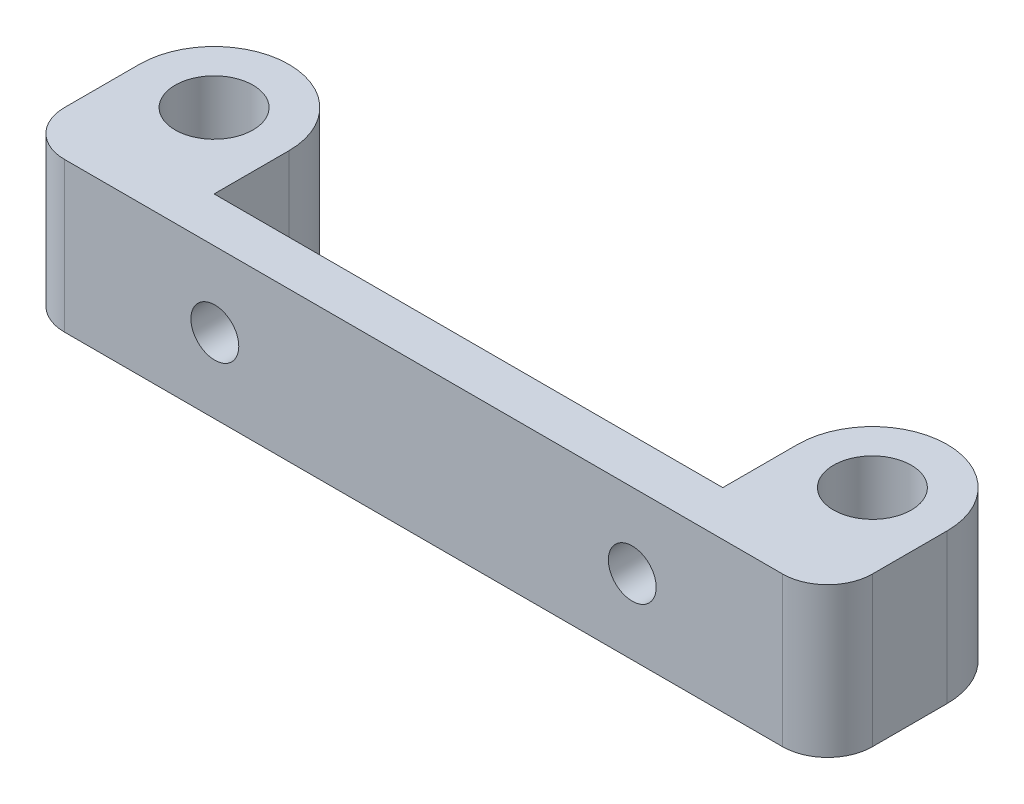
ISO-10303-21;
HEADER;
FILE_DESCRIPTION(('STEP AP214'),'2;1');
FILE_NAME('part.step','',(''),(''),'','','');
FILE_SCHEMA(('AUTOMOTIVE_DESIGN { 1 0 10303 214 1 1 1 1 }'));
ENDSEC;
DATA;
#1=APPLICATION_CONTEXT('core data for automotive mechanical design processes');
#2=APPLICATION_PROTOCOL_DEFINITION('international standard','automotive_design',2000,#1);
#3=PRODUCT_CONTEXT('',#1,'mechanical');
#4=PRODUCT('Part','Part','',(#3));
#5=PRODUCT_RELATED_PRODUCT_CATEGORY('part','',(#4));
#6=PRODUCT_DEFINITION_FORMATION('','',#4);
#7=PRODUCT_DEFINITION_CONTEXT('part definition',#1,'design');
#8=PRODUCT_DEFINITION('design','',#6,#7);
#9=PRODUCT_DEFINITION_SHAPE('','',#8);
#10=(LENGTH_UNIT() NAMED_UNIT(*) SI_UNIT(.MILLI.,.METRE.));
#11=(NAMED_UNIT(*) PLANE_ANGLE_UNIT() SI_UNIT($,.RADIAN.));
#12=(NAMED_UNIT(*) SI_UNIT($,.STERADIAN.) SOLID_ANGLE_UNIT());
#13=UNCERTAINTY_MEASURE_WITH_UNIT(LENGTH_MEASURE(1.E-05),#10,'distance_accuracy_value','');
#14=(GEOMETRIC_REPRESENTATION_CONTEXT(3) GLOBAL_UNCERTAINTY_ASSIGNED_CONTEXT((#13)) GLOBAL_UNIT_ASSIGNED_CONTEXT((#10,
#11,#12)) REPRESENTATION_CONTEXT('',''));
#15=CARTESIAN_POINT('',(0.,0.,0.));
#16=DIRECTION('',(0.,0.,1.));
#17=DIRECTION('',(1.,0.,0.));
#18=AXIS2_PLACEMENT_3D('',#15,#16,#17);
#19=CARTESIAN_POINT('',(0.,-5.,3.));
#20=DIRECTION('',(0.,1.,0.));
#21=DIRECTION('',(0.,0.,1.));
#22=AXIS2_PLACEMENT_3D('',#19,#20,#21);
#23=PLANE('',#22);
#24=DIRECTION('',(1.,0.,0.));
#25=VECTOR('',#24,1.);
#26=CARTESIAN_POINT('',(0.,-5.,3.));
#27=LINE('',#26,#25);
#28=CARTESIAN_POINT('',(-24.,-5.,3.));
#29=VERTEX_POINT('',#28);
#30=CARTESIAN_POINT('',(24.,-5.,3.));
#31=VERTEX_POINT('',#30);
#32=EDGE_CURVE('E193',#29,#31,#27,.T.);
#33=ORIENTED_EDGE('',*,*,#32,.F.);
#34=CARTESIAN_POINT('',(-24.,-5.,0.));
#35=DIRECTION('',(0.,1.,0.));
#36=DIRECTION('',(0.,0.,1.));
#37=AXIS2_PLACEMENT_3D('',#34,#35,#36);
#38=CIRCLE('',#37,3.);
#39=CARTESIAN_POINT('',(-27.,-5.,0.));
#40=VERTEX_POINT('',#39);
#41=EDGE_CURVE('E50',#29,#40,#38,.F.);
#42=ORIENTED_EDGE('',*,*,#41,.T.);
#43=DIRECTION('',(0.,0.,-1.));
#44=VECTOR('',#43,1.);
#45=CARTESIAN_POINT('',(-27.,-5.,3.));
#46=LINE('',#45,#44);
#47=CARTESIAN_POINT('',(-27.,-5.,-5.));
#48=VERTEX_POINT('',#47);
#49=EDGE_CURVE('E205',#40,#48,#46,.T.);
#50=ORIENTED_EDGE('',*,*,#49,.T.);
#51=CARTESIAN_POINT('',(-22.,-5.,-5.));
#52=DIRECTION('',(0.,1.,0.));
#53=DIRECTION('',(0.,0.,1.));
#54=AXIS2_PLACEMENT_3D('',#51,#52,#53);
#55=CIRCLE('',#54,5.);
#56=CARTESIAN_POINT('',(-17.,-5.,-5.));
#57=VERTEX_POINT('',#56);
#58=EDGE_CURVE('E159',#57,#48,#55,.T.);
#59=ORIENTED_EDGE('',*,*,#58,.F.);
#60=DIRECTION('',(0.,0.,1.));
#61=VECTOR('',#60,1.);
#62=CARTESIAN_POINT('',(-17.,-5.,0.));
#63=LINE('',#62,#61);
#64=CARTESIAN_POINT('',(-17.,-5.,0.));
#65=VERTEX_POINT('',#64);
#66=EDGE_CURVE('E164',#57,#65,#63,.T.);
#67=ORIENTED_EDGE('',*,*,#66,.T.);
#68=DIRECTION('',(1.,0.,0.));
#69=VECTOR('',#68,1.);
#70=CARTESIAN_POINT('',(0.,-5.,0.));
#71=LINE('',#70,#69);
#72=CARTESIAN_POINT('',(17.,-5.,0.));
#73=VERTEX_POINT('',#72);
#74=EDGE_CURVE('E209',#65,#73,#71,.T.);
#75=ORIENTED_EDGE('',*,*,#74,.T.);
#76=DIRECTION('',(0.,0.,1.));
#77=VECTOR('',#76,1.);
#78=CARTESIAN_POINT('',(17.,-5.,0.));
#79=LINE('',#78,#77);
#80=CARTESIAN_POINT('',(17.,-5.,-5.));
#81=VERTEX_POINT('',#80);
#82=EDGE_CURVE('E134',#81,#73,#79,.T.);
#83=ORIENTED_EDGE('',*,*,#82,.F.);
#84=CARTESIAN_POINT('',(22.,-5.,-5.));
#85=DIRECTION('',(0.,1.,0.));
#86=DIRECTION('',(0.,0.,1.));
#87=AXIS2_PLACEMENT_3D('',#84,#85,#86);
#88=CIRCLE('',#87,5.);
#89=CARTESIAN_POINT('',(27.,-5.,-5.));
#90=VERTEX_POINT('',#89);
#91=EDGE_CURVE('E130',#81,#90,#88,.F.);
#92=ORIENTED_EDGE('',*,*,#91,.T.);
#93=DIRECTION('',(0.,0.,-1.));
#94=VECTOR('',#93,1.);
#95=CARTESIAN_POINT('',(27.,-5.,3.));
#96=LINE('',#95,#94);
#97=CARTESIAN_POINT('',(27.,-5.,0.));
#98=VERTEX_POINT('',#97);
#99=EDGE_CURVE('E118',#98,#90,#96,.T.);
#100=ORIENTED_EDGE('',*,*,#99,.F.);
#101=CARTESIAN_POINT('',(24.,-5.,0.));
#102=DIRECTION('',(0.,1.,0.));
#103=DIRECTION('',(0.,0.,1.));
#104=AXIS2_PLACEMENT_3D('',#101,#102,#103);
#105=CIRCLE('',#104,3.);
#106=EDGE_CURVE('E57',#98,#31,#105,.F.);
#107=ORIENTED_EDGE('',*,*,#106,.T.);
#108=EDGE_LOOP('',(#33,#42,#50,#59,#67,#75,#83,#92,#100,#107));
#109=FACE_BOUND('',#108,.T.);
#110=CARTESIAN_POINT('',(-22.,-5.,-5.));
#111=DIRECTION('',(0.,1.,0.));
#112=DIRECTION('',(0.,0.,1.));
#113=AXIS2_PLACEMENT_3D('',#110,#111,#112);
#114=CIRCLE('',#113,2.6);
#115=CARTESIAN_POINT('',(-22.,-5.,-2.4));
#116=VERTEX_POINT('',#115);
#117=EDGE_CURVE('E155',#116,#116,#114,.T.);
#118=ORIENTED_EDGE('',*,*,#117,.T.);
#119=EDGE_LOOP('',(#118));
#120=FACE_BOUND('',#119,.T.);
#121=CARTESIAN_POINT('',(22.,-5.,-5.));
#122=DIRECTION('',(0.,1.,0.));
#123=DIRECTION('',(0.,0.,1.));
#124=AXIS2_PLACEMENT_3D('',#121,#122,#123);
#125=CIRCLE('',#124,2.6);
#126=CARTESIAN_POINT('',(22.,-5.,-2.4));
#127=VERTEX_POINT('',#126);
#128=EDGE_CURVE('E145',#127,#127,#125,.F.);
#129=ORIENTED_EDGE('',*,*,#128,.F.);
#130=EDGE_LOOP('',(#129));
#131=FACE_BOUND('',#130,.T.);
#132=ADVANCED_FACE('F41',(#109,#120,#131),#23,.F.);
#133=CARTESIAN_POINT('',(27.,0.,3.));
#134=DIRECTION('',(1.,0.,0.));
#135=DIRECTION('',(0.,0.,-1.));
#136=AXIS2_PLACEMENT_3D('',#133,#134,#135);
#137=PLANE('',#136);
#138=DIRECTION('',(0.,0.,-1.));
#139=VECTOR('',#138,1.);
#140=CARTESIAN_POINT('',(27.,5.,3.));
#141=LINE('',#140,#139);
#142=CARTESIAN_POINT('',(27.,5.,0.));
#143=VERTEX_POINT('',#142);
#144=CARTESIAN_POINT('',(27.,5.,-5.));
#145=VERTEX_POINT('',#144);
#146=EDGE_CURVE('E126',#143,#145,#141,.T.);
#147=ORIENTED_EDGE('',*,*,#146,.F.);
#148=DIRECTION('',(0.,-1.,0.));
#149=VECTOR('',#148,1.);
#150=CARTESIAN_POINT('',(27.,0.,0.));
#151=LINE('',#150,#149);
#152=EDGE_CURVE('E11',#143,#98,#151,.T.);
#153=ORIENTED_EDGE('',*,*,#152,.T.);
#154=ORIENTED_EDGE('',*,*,#99,.T.);
#155=DIRECTION('',(0.,1.,0.));
#156=VECTOR('',#155,1.);
#157=CARTESIAN_POINT('',(27.,-5.,-5.));
#158=LINE('',#157,#156);
#159=EDGE_CURVE('E123',#90,#145,#158,.T.);
#160=ORIENTED_EDGE('',*,*,#159,.T.);
#161=EDGE_LOOP('',(#147,#153,#154,#160));
#162=FACE_BOUND('',#161,.T.);
#163=ADVANCED_FACE('F121',(#162),#137,.T.);
#164=CARTESIAN_POINT('',(0.,5.,3.));
#165=DIRECTION('',(0.,1.,0.));
#166=DIRECTION('',(0.,0.,1.));
#167=AXIS2_PLACEMENT_3D('',#164,#165,#166);
#168=PLANE('',#167);
#169=DIRECTION('',(0.,0.,-1.));
#170=VECTOR('',#169,1.);
#171=CARTESIAN_POINT('',(-27.,5.,3.));
#172=LINE('',#171,#170);
#173=CARTESIAN_POINT('',(-27.,5.,0.));
#174=VERTEX_POINT('',#173);
#175=CARTESIAN_POINT('',(-27.,5.,-5.));
#176=VERTEX_POINT('',#175);
#177=EDGE_CURVE('E220',#174,#176,#172,.T.);
#178=ORIENTED_EDGE('',*,*,#177,.F.);
#179=CARTESIAN_POINT('',(-24.,5.,0.));
#180=DIRECTION('',(0.,1.,0.));
#181=DIRECTION('',(0.,0.,1.));
#182=AXIS2_PLACEMENT_3D('',#179,#180,#181);
#183=CIRCLE('',#182,3.);
#184=CARTESIAN_POINT('',(-24.,5.,3.));
#185=VERTEX_POINT('',#184);
#186=EDGE_CURVE('E231',#174,#185,#183,.T.);
#187=ORIENTED_EDGE('',*,*,#186,.T.);
#188=DIRECTION('',(1.,0.,0.));
#189=VECTOR('',#188,1.);
#190=CARTESIAN_POINT('',(0.,5.,3.));
#191=LINE('',#190,#189);
#192=CARTESIAN_POINT('',(24.,5.,3.));
#193=VERTEX_POINT('',#192);
#194=EDGE_CURVE('E197',#185,#193,#191,.T.);
#195=ORIENTED_EDGE('',*,*,#194,.T.);
#196=CARTESIAN_POINT('',(24.,5.,0.));
#197=DIRECTION('',(0.,1.,0.));
#198=DIRECTION('',(0.,0.,1.));
#199=AXIS2_PLACEMENT_3D('',#196,#197,#198);
#200=CIRCLE('',#199,3.);
#201=EDGE_CURVE('E228',#193,#143,#200,.T.);
#202=ORIENTED_EDGE('',*,*,#201,.T.);
#203=ORIENTED_EDGE('',*,*,#146,.T.);
#204=CARTESIAN_POINT('',(22.,5.,-5.));
#205=DIRECTION('',(0.,1.,0.));
#206=DIRECTION('',(0.,0.,1.));
#207=AXIS2_PLACEMENT_3D('',#204,#205,#206);
#208=CIRCLE('',#207,5.);
#209=CARTESIAN_POINT('',(17.,5.,-5.));
#210=VERTEX_POINT('',#209);
#211=EDGE_CURVE('E142',#210,#145,#208,.F.);
#212=ORIENTED_EDGE('',*,*,#211,.F.);
#213=DIRECTION('',(0.,0.,1.));
#214=VECTOR('',#213,1.);
#215=CARTESIAN_POINT('',(17.,5.,0.));
#216=LINE('',#215,#214);
#217=CARTESIAN_POINT('',(17.,5.,0.));
#218=VERTEX_POINT('',#217);
#219=EDGE_CURVE('E264',#210,#218,#216,.T.);
#220=ORIENTED_EDGE('',*,*,#219,.T.);
#221=DIRECTION('',(1.,0.,0.));
#222=VECTOR('',#221,1.);
#223=CARTESIAN_POINT('',(0.,5.,0.));
#224=LINE('',#223,#222);
#225=CARTESIAN_POINT('',(-17.,5.,0.));
#226=VERTEX_POINT('',#225);
#227=EDGE_CURVE('E212',#226,#218,#224,.T.);
#228=ORIENTED_EDGE('',*,*,#227,.F.);
#229=DIRECTION('',(0.,0.,1.));
#230=VECTOR('',#229,1.);
#231=CARTESIAN_POINT('',(-17.,5.,0.));
#232=LINE('',#231,#230);
#233=CARTESIAN_POINT('',(-17.,5.,-5.));
#234=VERTEX_POINT('',#233);
#235=EDGE_CURVE('E160',#234,#226,#232,.T.);
#236=ORIENTED_EDGE('',*,*,#235,.F.);
#237=CARTESIAN_POINT('',(-22.,5.,-5.));
#238=DIRECTION('',(0.,1.,0.));
#239=DIRECTION('',(0.,0.,1.));
#240=AXIS2_PLACEMENT_3D('',#237,#238,#239);
#241=CIRCLE('',#240,5.);
#242=EDGE_CURVE('E172',#234,#176,#241,.T.);
#243=ORIENTED_EDGE('',*,*,#242,.T.);
#244=EDGE_LOOP('',(#178,#187,#195,#202,#203,#212,#220,#228,#236,#243));
#245=FACE_BOUND('',#244,.T.);
#246=CARTESIAN_POINT('',(-22.,5.,-5.));
#247=DIRECTION('',(0.,1.,0.));
#248=DIRECTION('',(0.,0.,1.));
#249=AXIS2_PLACEMENT_3D('',#246,#247,#248);
#250=CIRCLE('',#249,2.6);
#251=CARTESIAN_POINT('',(-22.,5.,-2.4));
#252=VERTEX_POINT('',#251);
#253=EDGE_CURVE('E168',#252,#252,#250,.T.);
#254=ORIENTED_EDGE('',*,*,#253,.F.);
#255=EDGE_LOOP('',(#254));
#256=FACE_BOUND('',#255,.T.);
#257=CARTESIAN_POINT('',(22.,5.,-5.));
#258=DIRECTION('',(0.,1.,0.));
#259=DIRECTION('',(0.,0.,1.));
#260=AXIS2_PLACEMENT_3D('',#257,#258,#259);
#261=CIRCLE('',#260,2.6);
#262=CARTESIAN_POINT('',(22.,5.,-2.4));
#263=VERTEX_POINT('',#262);
#264=EDGE_CURVE('E137',#263,#263,#261,.F.);
#265=ORIENTED_EDGE('',*,*,#264,.T.);
#266=EDGE_LOOP('',(#265));
#267=FACE_BOUND('',#266,.T.);
#268=ADVANCED_FACE('F255',(#245,#256,#267),#168,.T.);
#269=CARTESIAN_POINT('',(-27.,0.,3.));
#270=DIRECTION('',(-1.,0.,0.));
#271=DIRECTION('',(0.,0.,1.));
#272=AXIS2_PLACEMENT_3D('',#269,#270,#271);
#273=PLANE('',#272);
#274=ORIENTED_EDGE('',*,*,#49,.F.);
#275=DIRECTION('',(0.,1.,0.));
#276=VECTOR('',#275,1.);
#277=CARTESIAN_POINT('',(-27.,0.,0.));
#278=LINE('',#277,#276);
#279=EDGE_CURVE('E125',#40,#174,#278,.T.);
#280=ORIENTED_EDGE('',*,*,#279,.T.);
#281=ORIENTED_EDGE('',*,*,#177,.T.);
#282=DIRECTION('',(0.,1.,0.));
#283=VECTOR('',#282,1.);
#284=CARTESIAN_POINT('',(-27.,-5.,-5.));
#285=LINE('',#284,#283);
#286=EDGE_CURVE('E167',#48,#176,#285,.T.);
#287=ORIENTED_EDGE('',*,*,#286,.F.);
#288=EDGE_LOOP('',(#274,#280,#281,#287));
#289=FACE_BOUND('',#288,.T.);
#290=ADVANCED_FACE('F250',(#289),#273,.T.);
#291=CARTESIAN_POINT('',(13.95,0.,3.));
#292=DIRECTION('',(0.,0.,-1.));
#293=DIRECTION('',(-1.,0.,0.));
#294=AXIS2_PLACEMENT_3D('',#291,#292,#293);
#295=CYLINDRICAL_SURFACE('',#294,1.6);
#296=CARTESIAN_POINT('',(13.95,0.,3.));
#297=DIRECTION('',(0.,0.,1.));
#298=DIRECTION('',(1.,0.,0.));
#299=AXIS2_PLACEMENT_3D('',#296,#297,#298);
#300=CIRCLE('',#299,1.6);
#301=CARTESIAN_POINT('',(15.55,0.,3.));
#302=VERTEX_POINT('',#301);
#303=EDGE_CURVE('E189',#302,#302,#300,.T.);
#304=ORIENTED_EDGE('',*,*,#303,.T.);
#305=EDGE_LOOP('',(#304));
#306=FACE_BOUND('',#305,.T.);
#307=CARTESIAN_POINT('',(13.95,0.,0.));
#308=DIRECTION('',(0.,0.,1.));
#309=DIRECTION('',(1.,0.,0.));
#310=AXIS2_PLACEMENT_3D('',#307,#308,#309);
#311=CIRCLE('',#310,1.6);
#312=CARTESIAN_POINT('',(15.55,0.,0.));
#313=VERTEX_POINT('',#312);
#314=EDGE_CURVE('E181',#313,#313,#311,.T.);
#315=ORIENTED_EDGE('',*,*,#314,.F.);
#316=EDGE_LOOP('',(#315));
#317=FACE_BOUND('',#316,.T.);
#318=ADVANCED_FACE('F299',(#306,#317),#295,.F.);
#319=CARTESIAN_POINT('',(-13.95,0.,3.));
#320=DIRECTION('',(0.,0.,-1.));
#321=DIRECTION('',(-1.,0.,0.));
#322=AXIS2_PLACEMENT_3D('',#319,#320,#321);
#323=CYLINDRICAL_SURFACE('',#322,1.6);
#324=CARTESIAN_POINT('',(-13.95,0.,3.));
#325=DIRECTION('',(0.,0.,1.));
#326=DIRECTION('',(1.,0.,0.));
#327=AXIS2_PLACEMENT_3D('',#324,#325,#326);
#328=CIRCLE('',#327,1.6);
#329=CARTESIAN_POINT('',(-12.35,0.,3.));
#330=VERTEX_POINT('',#329);
#331=EDGE_CURVE('E201',#330,#330,#328,.F.);
#332=ORIENTED_EDGE('',*,*,#331,.F.);
#333=EDGE_LOOP('',(#332));
#334=FACE_BOUND('',#333,.T.);
#335=CARTESIAN_POINT('',(-13.95,0.,0.));
#336=DIRECTION('',(0.,0.,1.));
#337=DIRECTION('',(1.,0.,0.));
#338=AXIS2_PLACEMENT_3D('',#335,#336,#337);
#339=CIRCLE('',#338,1.6);
#340=CARTESIAN_POINT('',(-12.35,0.,0.));
#341=VERTEX_POINT('',#340);
#342=EDGE_CURVE('E194',#341,#341,#339,.F.);
#343=ORIENTED_EDGE('',*,*,#342,.T.);
#344=EDGE_LOOP('',(#343));
#345=FACE_BOUND('',#344,.T.);
#346=ADVANCED_FACE('F301',(#334,#345),#323,.F.);
#347=CARTESIAN_POINT('',(0.,0.,3.));
#348=DIRECTION('',(0.,0.,1.));
#349=DIRECTION('',(1.,0.,0.));
#350=AXIS2_PLACEMENT_3D('',#347,#348,#349);
#351=PLANE('',#350);
#352=ORIENTED_EDGE('',*,*,#303,.F.);
#353=EDGE_LOOP('',(#352));
#354=FACE_BOUND('',#353,.T.);
#355=ORIENTED_EDGE('',*,*,#194,.F.);
#356=DIRECTION('',(0.,1.,0.));
#357=VECTOR('',#356,1.);
#358=CARTESIAN_POINT('',(-24.,0.,3.));
#359=LINE('',#358,#357);
#360=EDGE_CURVE('E237',#185,#29,#359,.F.);
#361=ORIENTED_EDGE('',*,*,#360,.T.);
#362=ORIENTED_EDGE('',*,*,#32,.T.);
#363=DIRECTION('',(0.,-1.,0.));
#364=VECTOR('',#363,1.);
#365=CARTESIAN_POINT('',(24.,0.,3.));
#366=LINE('',#365,#364);
#367=EDGE_CURVE('E234',#31,#193,#366,.F.);
#368=ORIENTED_EDGE('',*,*,#367,.T.);
#369=EDGE_LOOP('',(#355,#361,#362,#368));
#370=FACE_BOUND('',#369,.T.);
#371=ORIENTED_EDGE('',*,*,#331,.T.);
#372=EDGE_LOOP('',(#371));
#373=FACE_BOUND('',#372,.T.);
#374=ADVANCED_FACE('F259',(#354,#370,#373),#351,.T.);
#375=CARTESIAN_POINT('',(0.,0.,0.));
#376=DIRECTION('',(0.,0.,1.));
#377=DIRECTION('',(1.,0.,0.));
#378=AXIS2_PLACEMENT_3D('',#375,#376,#377);
#379=PLANE('',#378);
#380=ORIENTED_EDGE('',*,*,#314,.T.);
#381=EDGE_LOOP('',(#380));
#382=FACE_BOUND('',#381,.T.);
#383=ORIENTED_EDGE('',*,*,#227,.T.);
#384=DIRECTION('',(0.,1.,0.));
#385=VECTOR('',#384,1.);
#386=CARTESIAN_POINT('',(17.,-5.,0.));
#387=LINE('',#386,#385);
#388=EDGE_CURVE('E149',#73,#218,#387,.T.);
#389=ORIENTED_EDGE('',*,*,#388,.F.);
#390=ORIENTED_EDGE('',*,*,#74,.F.);
#391=DIRECTION('',(0.,1.,0.));
#392=VECTOR('',#391,1.);
#393=CARTESIAN_POINT('',(-17.,-5.,0.));
#394=LINE('',#393,#392);
#395=EDGE_CURVE('E182',#65,#226,#394,.T.);
#396=ORIENTED_EDGE('',*,*,#395,.T.);
#397=EDGE_LOOP('',(#383,#389,#390,#396));
#398=FACE_BOUND('',#397,.T.);
#399=ORIENTED_EDGE('',*,*,#342,.F.);
#400=EDGE_LOOP('',(#399));
#401=FACE_BOUND('',#400,.T.);
#402=ADVANCED_FACE('F314',(#382,#398,#401),#379,.F.);
#403=CARTESIAN_POINT('',(-22.,-5.,-5.));
#404=DIRECTION('',(0.,1.,0.));
#405=DIRECTION('',(0.,0.,1.));
#406=AXIS2_PLACEMENT_3D('',#403,#404,#405);
#407=CYLINDRICAL_SURFACE('',#406,5.);
#408=ORIENTED_EDGE('',*,*,#242,.F.);
#409=DIRECTION('',(0.,1.,0.));
#410=VECTOR('',#409,1.);
#411=CARTESIAN_POINT('',(-17.,-5.,-5.));
#412=LINE('',#411,#410);
#413=EDGE_CURVE('E178',#57,#234,#412,.T.);
#414=ORIENTED_EDGE('',*,*,#413,.F.);
#415=ORIENTED_EDGE('',*,*,#58,.T.);
#416=ORIENTED_EDGE('',*,*,#286,.T.);
#417=EDGE_LOOP('',(#408,#414,#415,#416));
#418=FACE_BOUND('',#417,.T.);
#419=ADVANCED_FACE('F317',(#418),#407,.T.);
#420=CARTESIAN_POINT('',(-17.,-5.,0.));
#421=DIRECTION('',(-1.,0.,0.));
#422=DIRECTION('',(0.,0.,1.));
#423=AXIS2_PLACEMENT_3D('',#420,#421,#422);
#424=PLANE('',#423);
#425=ORIENTED_EDGE('',*,*,#235,.T.);
#426=ORIENTED_EDGE('',*,*,#395,.F.);
#427=ORIENTED_EDGE('',*,*,#66,.F.);
#428=ORIENTED_EDGE('',*,*,#413,.T.);
#429=EDGE_LOOP('',(#425,#426,#427,#428));
#430=FACE_BOUND('',#429,.T.);
#431=ADVANCED_FACE('F329',(#430),#424,.F.);
#432=CARTESIAN_POINT('',(-22.,-5.,-5.));
#433=DIRECTION('',(0.,1.,0.));
#434=DIRECTION('',(0.,0.,1.));
#435=AXIS2_PLACEMENT_3D('',#432,#433,#434);
#436=CYLINDRICAL_SURFACE('',#435,2.6);
#437=ORIENTED_EDGE('',*,*,#117,.F.);
#438=EDGE_LOOP('',(#437));
#439=FACE_BOUND('',#438,.T.);
#440=ORIENTED_EDGE('',*,*,#253,.T.);
#441=EDGE_LOOP('',(#440));
#442=FACE_BOUND('',#441,.T.);
#443=ADVANCED_FACE('F331',(#439,#442),#436,.F.);
#444=CARTESIAN_POINT('',(17.,-5.,0.));
#445=DIRECTION('',(-1.,0.,0.));
#446=DIRECTION('',(0.,0.,1.));
#447=AXIS2_PLACEMENT_3D('',#444,#445,#446);
#448=PLANE('',#447);
#449=ORIENTED_EDGE('',*,*,#219,.F.);
#450=DIRECTION('',(0.,1.,0.));
#451=VECTOR('',#450,1.);
#452=CARTESIAN_POINT('',(17.,-5.,-5.));
#453=LINE('',#452,#451);
#454=EDGE_CURVE('E144',#81,#210,#453,.T.);
#455=ORIENTED_EDGE('',*,*,#454,.F.);
#456=ORIENTED_EDGE('',*,*,#82,.T.);
#457=ORIENTED_EDGE('',*,*,#388,.T.);
#458=EDGE_LOOP('',(#449,#455,#456,#457));
#459=FACE_BOUND('',#458,.T.);
#460=ADVANCED_FACE('F269',(#459),#448,.T.);
#461=CARTESIAN_POINT('',(22.,-5.,-5.));
#462=DIRECTION('',(0.,1.,0.));
#463=DIRECTION('',(0.,0.,1.));
#464=AXIS2_PLACEMENT_3D('',#461,#462,#463);
#465=CYLINDRICAL_SURFACE('',#464,5.);
#466=ORIENTED_EDGE('',*,*,#211,.T.);
#467=ORIENTED_EDGE('',*,*,#159,.F.);
#468=ORIENTED_EDGE('',*,*,#91,.F.);
#469=ORIENTED_EDGE('',*,*,#454,.T.);
#470=EDGE_LOOP('',(#466,#467,#468,#469));
#471=FACE_BOUND('',#470,.T.);
#472=ADVANCED_FACE('F140',(#471),#465,.T.);
#473=CARTESIAN_POINT('',(22.,-5.,-5.));
#474=DIRECTION('',(0.,1.,0.));
#475=DIRECTION('',(0.,0.,1.));
#476=AXIS2_PLACEMENT_3D('',#473,#474,#475);
#477=CYLINDRICAL_SURFACE('',#476,2.6);
#478=ORIENTED_EDGE('',*,*,#128,.T.);
#479=EDGE_LOOP('',(#478));
#480=FACE_BOUND('',#479,.T.);
#481=ORIENTED_EDGE('',*,*,#264,.F.);
#482=EDGE_LOOP('',(#481));
#483=FACE_BOUND('',#482,.T.);
#484=ADVANCED_FACE('F281',(#480,#483),#477,.F.);
#485=CARTESIAN_POINT('',(-24.,0.,0.));
#486=DIRECTION('',(0.,1.,0.));
#487=DIRECTION('',(0.,0.,1.));
#488=AXIS2_PLACEMENT_3D('',#485,#486,#487);
#489=CYLINDRICAL_SURFACE('',#488,3.);
#490=ORIENTED_EDGE('',*,*,#41,.F.);
#491=ORIENTED_EDGE('',*,*,#360,.F.);
#492=ORIENTED_EDGE('',*,*,#186,.F.);
#493=ORIENTED_EDGE('',*,*,#279,.F.);
#494=EDGE_LOOP('',(#490,#491,#492,#493));
#495=FACE_BOUND('',#494,.T.);
#496=ADVANCED_FACE('F252',(#495),#489,.T.);
#497=CARTESIAN_POINT('',(24.,0.,0.));
#498=DIRECTION('',(0.,-1.,0.));
#499=DIRECTION('',(0.,0.,-1.));
#500=AXIS2_PLACEMENT_3D('',#497,#498,#499);
#501=CYLINDRICAL_SURFACE('',#500,3.);
#502=ORIENTED_EDGE('',*,*,#201,.F.);
#503=ORIENTED_EDGE('',*,*,#367,.F.);
#504=ORIENTED_EDGE('',*,*,#106,.F.);
#505=ORIENTED_EDGE('',*,*,#152,.F.);
#506=EDGE_LOOP('',(#502,#503,#504,#505));
#507=FACE_BOUND('',#506,.T.);
#508=ADVANCED_FACE('F43',(#507),#501,.T.);
#509=CLOSED_SHELL('',(#132,#163,#268,#290,#318,#346,#374,#402,#419,#431,#443,#460,#472,#484,
#496,#508));
#510=MANIFOLD_SOLID_BREP('B2',#509);
#511=ADVANCED_BREP_SHAPE_REPRESENTATION('',(#18,#510),#14);
#512=SHAPE_DEFINITION_REPRESENTATION(#9,#511);
ENDSEC;
END-ISO-10303-21;
